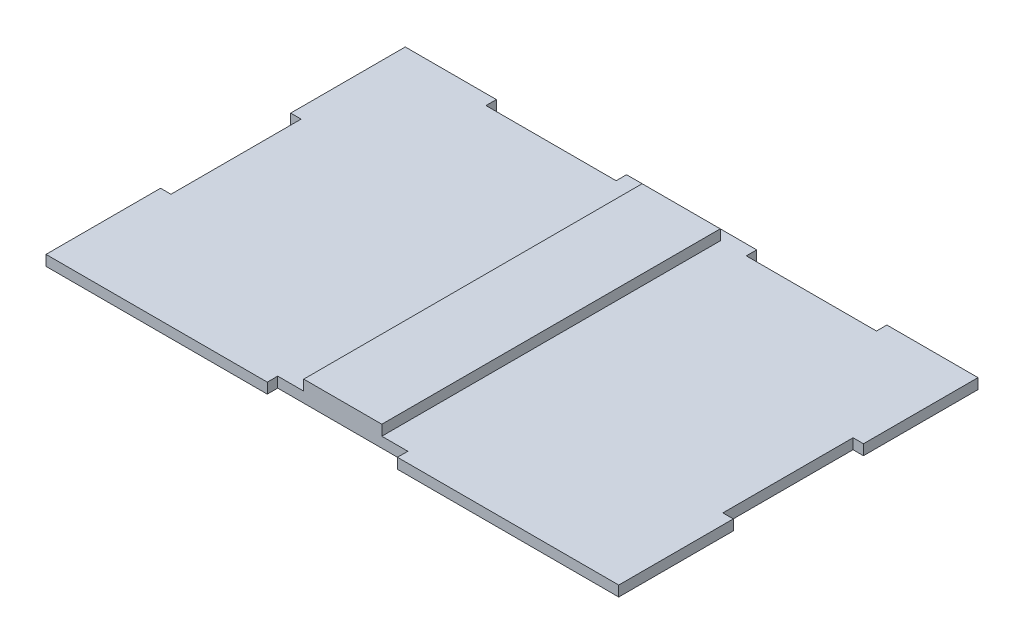
ISO-10303-21;
HEADER;
FILE_DESCRIPTION(('STEP AP214'),'2;1');
FILE_NAME('part.step','',(''),(''),'','','');
FILE_SCHEMA(('AUTOMOTIVE_DESIGN { 1 0 10303 214 1 1 1 1 }'));
ENDSEC;
DATA;
#1=APPLICATION_CONTEXT('core data for automotive mechanical design processes');
#2=APPLICATION_PROTOCOL_DEFINITION('international standard','automotive_design',2000,#1);
#3=PRODUCT_CONTEXT('',#1,'mechanical');
#4=PRODUCT('Part','Part','',(#3));
#5=PRODUCT_RELATED_PRODUCT_CATEGORY('part','',(#4));
#6=PRODUCT_DEFINITION_FORMATION('','',#4);
#7=PRODUCT_DEFINITION_CONTEXT('part definition',#1,'design');
#8=PRODUCT_DEFINITION('design','',#6,#7);
#9=PRODUCT_DEFINITION_SHAPE('','',#8);
#10=(LENGTH_UNIT() NAMED_UNIT(*) SI_UNIT(.MILLI.,.METRE.));
#11=(NAMED_UNIT(*) PLANE_ANGLE_UNIT() SI_UNIT($,.RADIAN.));
#12=(NAMED_UNIT(*) SI_UNIT($,.STERADIAN.) SOLID_ANGLE_UNIT());
#13=UNCERTAINTY_MEASURE_WITH_UNIT(LENGTH_MEASURE(1.E-05),#10,'distance_accuracy_value','');
#14=(GEOMETRIC_REPRESENTATION_CONTEXT(3) GLOBAL_UNCERTAINTY_ASSIGNED_CONTEXT((#13)) GLOBAL_UNIT_ASSIGNED_CONTEXT((#10,
#11,#12)) REPRESENTATION_CONTEXT('',''));
#15=CARTESIAN_POINT('',(0.,0.,0.));
#16=DIRECTION('',(0.,0.,1.));
#17=DIRECTION('',(1.,0.,0.));
#18=AXIS2_PLACEMENT_3D('',#15,#16,#17);
#19=CARTESIAN_POINT('',(-75.,4.,-69.));
#20=DIRECTION('',(0.,0.,1.));
#21=DIRECTION('',(1.,0.,0.));
#22=AXIS2_PLACEMENT_3D('',#19,#20,#21);
#23=PLANE('',#22);
#24=DIRECTION('',(-1.,0.,0.));
#25=VECTOR('',#24,1.);
#26=CARTESIAN_POINT('',(-75.,0.,-69.));
#27=LINE('',#26,#25);
#28=CARTESIAN_POINT('',(-75.,0.,-69.));
#29=VERTEX_POINT('',#28);
#30=CARTESIAN_POINT('',(-110.,0.,-69.));
#31=VERTEX_POINT('',#30);
#32=EDGE_CURVE('E255',#29,#31,#27,.T.);
#33=ORIENTED_EDGE('',*,*,#32,.T.);
#34=DIRECTION('',(0.,-1.,0.));
#35=VECTOR('',#34,1.);
#36=CARTESIAN_POINT('',(-110.,4.,-69.));
#37=LINE('',#36,#35);
#38=CARTESIAN_POINT('',(-110.,4.,-69.));
#39=VERTEX_POINT('',#38);
#40=EDGE_CURVE('E11',#39,#31,#37,.T.);
#41=ORIENTED_EDGE('',*,*,#40,.F.);
#42=DIRECTION('',(-1.,0.,0.));
#43=VECTOR('',#42,1.);
#44=CARTESIAN_POINT('',(-75.,4.,-69.));
#45=LINE('',#44,#43);
#46=CARTESIAN_POINT('',(-75.,4.,-69.));
#47=VERTEX_POINT('',#46);
#48=EDGE_CURVE('E266',#47,#39,#45,.T.);
#49=ORIENTED_EDGE('',*,*,#48,.F.);
#50=DIRECTION('',(0.,-1.,0.));
#51=VECTOR('',#50,1.);
#52=CARTESIAN_POINT('',(-75.,4.,-69.));
#53=LINE('',#52,#51);
#54=EDGE_CURVE('E339',#47,#29,#53,.T.);
#55=ORIENTED_EDGE('',*,*,#54,.T.);
#56=EDGE_LOOP('',(#33,#41,#49,#55));
#57=FACE_BOUND('',#56,.T.);
#58=ADVANCED_FACE('F45',(#57),#23,.F.);
#59=CARTESIAN_POINT('',(-110.,4.,-69.));
#60=DIRECTION('',(1.,0.,0.));
#61=DIRECTION('',(0.,0.,-1.));
#62=AXIS2_PLACEMENT_3D('',#59,#60,#61);
#63=PLANE('',#62);
#64=DIRECTION('',(0.,0.,1.));
#65=VECTOR('',#64,1.);
#66=CARTESIAN_POINT('',(-110.,0.,-69.));
#67=LINE('',#66,#65);
#68=CARTESIAN_POINT('',(-110.,0.,-25.));
#69=VERTEX_POINT('',#68);
#70=EDGE_CURVE('E260',#31,#69,#67,.T.);
#71=ORIENTED_EDGE('',*,*,#70,.T.);
#72=DIRECTION('',(0.,-1.,0.));
#73=VECTOR('',#72,1.);
#74=CARTESIAN_POINT('',(-110.,4.,-25.));
#75=LINE('',#74,#73);
#76=CARTESIAN_POINT('',(-110.,4.,-25.));
#77=VERTEX_POINT('',#76);
#78=EDGE_CURVE('E53',#77,#69,#75,.T.);
#79=ORIENTED_EDGE('',*,*,#78,.F.);
#80=DIRECTION('',(0.,0.,1.));
#81=VECTOR('',#80,1.);
#82=CARTESIAN_POINT('',(-110.,4.,-69.));
#83=LINE('',#82,#81);
#84=EDGE_CURVE('E270',#39,#77,#83,.T.);
#85=ORIENTED_EDGE('',*,*,#84,.F.);
#86=ORIENTED_EDGE('',*,*,#40,.T.);
#87=EDGE_LOOP('',(#71,#79,#85,#86));
#88=FACE_BOUND('',#87,.T.);
#89=ADVANCED_FACE('F522',(#88),#63,.F.);
#90=CARTESIAN_POINT('',(-106.,4.,-25.));
#91=DIRECTION('',(0.,0.,-1.));
#92=DIRECTION('',(-1.,0.,0.));
#93=AXIS2_PLACEMENT_3D('',#90,#91,#92);
#94=PLANE('',#93);
#95=DIRECTION('',(1.,0.,0.));
#96=VECTOR('',#95,1.);
#97=CARTESIAN_POINT('',(-106.,0.,-25.));
#98=LINE('',#97,#96);
#99=CARTESIAN_POINT('',(-106.,0.,-25.));
#100=VERTEX_POINT('',#99);
#101=EDGE_CURVE('E343',#69,#100,#98,.T.);
#102=ORIENTED_EDGE('',*,*,#101,.T.);
#103=DIRECTION('',(0.,-1.,0.));
#104=VECTOR('',#103,1.);
#105=CARTESIAN_POINT('',(-106.,4.,-25.));
#106=LINE('',#105,#104);
#107=CARTESIAN_POINT('',(-106.,4.,-25.));
#108=VERTEX_POINT('',#107);
#109=EDGE_CURVE('E491',#108,#100,#106,.T.);
#110=ORIENTED_EDGE('',*,*,#109,.F.);
#111=DIRECTION('',(1.,0.,0.));
#112=VECTOR('',#111,1.);
#113=CARTESIAN_POINT('',(-106.,4.,-25.));
#114=LINE('',#113,#112);
#115=EDGE_CURVE('E274',#77,#108,#114,.T.);
#116=ORIENTED_EDGE('',*,*,#115,.F.);
#117=ORIENTED_EDGE('',*,*,#78,.T.);
#118=EDGE_LOOP('',(#102,#110,#116,#117));
#119=FACE_BOUND('',#118,.T.);
#120=ADVANCED_FACE('F500',(#119),#94,.F.);
#121=CARTESIAN_POINT('',(-106.,4.,-25.));
#122=DIRECTION('',(1.,0.,0.));
#123=DIRECTION('',(0.,0.,-1.));
#124=AXIS2_PLACEMENT_3D('',#121,#122,#123);
#125=PLANE('',#124);
#126=DIRECTION('',(0.,0.,1.));
#127=VECTOR('',#126,1.);
#128=CARTESIAN_POINT('',(-106.,0.,-25.));
#129=LINE('',#128,#127);
#130=CARTESIAN_POINT('',(-106.,0.,25.));
#131=VERTEX_POINT('',#130);
#132=EDGE_CURVE('E346',#100,#131,#129,.T.);
#133=ORIENTED_EDGE('',*,*,#132,.T.);
#134=DIRECTION('',(0.,-1.,0.));
#135=VECTOR('',#134,1.);
#136=CARTESIAN_POINT('',(-106.,4.,25.));
#137=LINE('',#136,#135);
#138=CARTESIAN_POINT('',(-106.,4.,25.));
#139=VERTEX_POINT('',#138);
#140=EDGE_CURVE('E487',#139,#131,#137,.T.);
#141=ORIENTED_EDGE('',*,*,#140,.F.);
#142=DIRECTION('',(0.,0.,1.));
#143=VECTOR('',#142,1.);
#144=CARTESIAN_POINT('',(-106.,4.,-25.));
#145=LINE('',#144,#143);
#146=EDGE_CURVE('E277',#108,#139,#145,.T.);
#147=ORIENTED_EDGE('',*,*,#146,.F.);
#148=ORIENTED_EDGE('',*,*,#109,.T.);
#149=EDGE_LOOP('',(#133,#141,#147,#148));
#150=FACE_BOUND('',#149,.T.);
#151=ADVANCED_FACE('F511',(#150),#125,.F.);
#152=CARTESIAN_POINT('',(-106.,4.,25.));
#153=DIRECTION('',(0.,0.,1.));
#154=DIRECTION('',(1.,0.,0.));
#155=AXIS2_PLACEMENT_3D('',#152,#153,#154);
#156=PLANE('',#155);
#157=DIRECTION('',(-1.,0.,0.));
#158=VECTOR('',#157,1.);
#159=CARTESIAN_POINT('',(-106.,0.,25.));
#160=LINE('',#159,#158);
#161=CARTESIAN_POINT('',(-110.,0.,25.));
#162=VERTEX_POINT('',#161);
#163=EDGE_CURVE('E349',#131,#162,#160,.T.);
#164=ORIENTED_EDGE('',*,*,#163,.T.);
#165=DIRECTION('',(0.,-1.,0.));
#166=VECTOR('',#165,1.);
#167=CARTESIAN_POINT('',(-110.,4.,25.));
#168=LINE('',#167,#166);
#169=CARTESIAN_POINT('',(-110.,4.,25.));
#170=VERTEX_POINT('',#169);
#171=EDGE_CURVE('E483',#170,#162,#168,.T.);
#172=ORIENTED_EDGE('',*,*,#171,.F.);
#173=DIRECTION('',(-1.,0.,0.));
#174=VECTOR('',#173,1.);
#175=CARTESIAN_POINT('',(-106.,4.,25.));
#176=LINE('',#175,#174);
#177=EDGE_CURVE('E280',#139,#170,#176,.T.);
#178=ORIENTED_EDGE('',*,*,#177,.F.);
#179=ORIENTED_EDGE('',*,*,#140,.T.);
#180=EDGE_LOOP('',(#164,#172,#178,#179));
#181=FACE_BOUND('',#180,.T.);
#182=ADVANCED_FACE('F515',(#181),#156,.F.);
#183=CARTESIAN_POINT('',(-110.,4.,25.));
#184=DIRECTION('',(1.,0.,0.));
#185=DIRECTION('',(0.,0.,-1.));
#186=AXIS2_PLACEMENT_3D('',#183,#184,#185);
#187=PLANE('',#186);
#188=DIRECTION('',(0.,0.,1.));
#189=VECTOR('',#188,1.);
#190=CARTESIAN_POINT('',(-110.,0.,25.));
#191=LINE('',#190,#189);
#192=CARTESIAN_POINT('',(-110.,0.,69.));
#193=VERTEX_POINT('',#192);
#194=EDGE_CURVE('E352',#162,#193,#191,.T.);
#195=ORIENTED_EDGE('',*,*,#194,.T.);
#196=DIRECTION('',(0.,-1.,0.));
#197=VECTOR('',#196,1.);
#198=CARTESIAN_POINT('',(-110.,4.,69.));
#199=LINE('',#198,#197);
#200=CARTESIAN_POINT('',(-110.,4.,69.));
#201=VERTEX_POINT('',#200);
#202=EDGE_CURVE('E479',#201,#193,#199,.T.);
#203=ORIENTED_EDGE('',*,*,#202,.F.);
#204=DIRECTION('',(0.,0.,1.));
#205=VECTOR('',#204,1.);
#206=CARTESIAN_POINT('',(-110.,4.,25.));
#207=LINE('',#206,#205);
#208=EDGE_CURVE('E283',#170,#201,#207,.T.);
#209=ORIENTED_EDGE('',*,*,#208,.F.);
#210=ORIENTED_EDGE('',*,*,#171,.T.);
#211=EDGE_LOOP('',(#195,#203,#209,#210));
#212=FACE_BOUND('',#211,.T.);
#213=ADVANCED_FACE('F612',(#212),#187,.F.);
#214=CARTESIAN_POINT('',(-110.,4.,69.));
#215=DIRECTION('',(0.,0.,-1.));
#216=DIRECTION('',(-1.,0.,0.));
#217=AXIS2_PLACEMENT_3D('',#214,#215,#216);
#218=PLANE('',#217);
#219=DIRECTION('',(1.,0.,0.));
#220=VECTOR('',#219,1.);
#221=CARTESIAN_POINT('',(-110.,0.,69.));
#222=LINE('',#221,#220);
#223=CARTESIAN_POINT('',(-25.,0.,69.));
#224=VERTEX_POINT('',#223);
#225=EDGE_CURVE('E355',#193,#224,#222,.T.);
#226=ORIENTED_EDGE('',*,*,#225,.T.);
#227=DIRECTION('',(0.,-1.,0.));
#228=VECTOR('',#227,1.);
#229=CARTESIAN_POINT('',(-25.,4.,69.));
#230=LINE('',#229,#228);
#231=CARTESIAN_POINT('',(-25.,4.,69.));
#232=VERTEX_POINT('',#231);
#233=EDGE_CURVE('E475',#232,#224,#230,.T.);
#234=ORIENTED_EDGE('',*,*,#233,.F.);
#235=DIRECTION('',(1.,0.,0.));
#236=VECTOR('',#235,1.);
#237=CARTESIAN_POINT('',(-110.,4.,69.));
#238=LINE('',#237,#236);
#239=EDGE_CURVE('E286',#201,#232,#238,.T.);
#240=ORIENTED_EDGE('',*,*,#239,.F.);
#241=ORIENTED_EDGE('',*,*,#202,.T.);
#242=EDGE_LOOP('',(#226,#234,#240,#241));
#243=FACE_BOUND('',#242,.T.);
#244=ADVANCED_FACE('F610',(#243),#218,.F.);
#245=CARTESIAN_POINT('',(-25.,4.,65.));
#246=DIRECTION('',(-1.,0.,0.));
#247=DIRECTION('',(0.,0.,1.));
#248=AXIS2_PLACEMENT_3D('',#245,#246,#247);
#249=PLANE('',#248);
#250=DIRECTION('',(0.,0.,-1.));
#251=VECTOR('',#250,1.);
#252=CARTESIAN_POINT('',(-25.,0.,65.));
#253=LINE('',#252,#251);
#254=CARTESIAN_POINT('',(-25.,0.,65.));
#255=VERTEX_POINT('',#254);
#256=EDGE_CURVE('E358',#224,#255,#253,.T.);
#257=ORIENTED_EDGE('',*,*,#256,.T.);
#258=DIRECTION('',(0.,-1.,0.));
#259=VECTOR('',#258,1.);
#260=CARTESIAN_POINT('',(-25.,4.,65.));
#261=LINE('',#260,#259);
#262=CARTESIAN_POINT('',(-25.,4.,65.));
#263=VERTEX_POINT('',#262);
#264=EDGE_CURVE('E471',#263,#255,#261,.T.);
#265=ORIENTED_EDGE('',*,*,#264,.F.);
#266=DIRECTION('',(0.,0.,-1.));
#267=VECTOR('',#266,1.);
#268=CARTESIAN_POINT('',(-25.,4.,65.));
#269=LINE('',#268,#267);
#270=EDGE_CURVE('E289',#232,#263,#269,.T.);
#271=ORIENTED_EDGE('',*,*,#270,.F.);
#272=ORIENTED_EDGE('',*,*,#233,.T.);
#273=EDGE_LOOP('',(#257,#265,#271,#272));
#274=FACE_BOUND('',#273,.T.);
#275=ADVANCED_FACE('F606',(#274),#249,.F.);
#276=CARTESIAN_POINT('',(-25.,4.,65.));
#277=DIRECTION('',(0.,0.,-1.));
#278=DIRECTION('',(-1.,0.,0.));
#279=AXIS2_PLACEMENT_3D('',#276,#277,#278);
#280=PLANE('',#279);
#281=DIRECTION('',(1.,0.,0.));
#282=VECTOR('',#281,1.);
#283=CARTESIAN_POINT('',(-25.,0.,65.));
#284=LINE('',#283,#282);
#285=CARTESIAN_POINT('',(25.,0.,65.));
#286=VERTEX_POINT('',#285);
#287=EDGE_CURVE('E361',#255,#286,#284,.T.);
#288=ORIENTED_EDGE('',*,*,#287,.T.);
#289=DIRECTION('',(0.,-1.,0.));
#290=VECTOR('',#289,1.);
#291=CARTESIAN_POINT('',(25.,4.,65.));
#292=LINE('',#291,#290);
#293=CARTESIAN_POINT('',(25.,4.,65.));
#294=VERTEX_POINT('',#293);
#295=EDGE_CURVE('E467',#294,#286,#292,.T.);
#296=ORIENTED_EDGE('',*,*,#295,.F.);
#297=DIRECTION('',(1.,0.,0.));
#298=VECTOR('',#297,1.);
#299=CARTESIAN_POINT('',(-25.,4.,65.));
#300=LINE('',#299,#298);
#301=CARTESIAN_POINT('',(15.,4.,65.));
#302=VERTEX_POINT('',#301);
#303=EDGE_CURVE('E253',#302,#294,#300,.T.);
#304=ORIENTED_EDGE('',*,*,#303,.F.);
#305=DIRECTION('',(0.,-1.,0.));
#306=VECTOR('',#305,1.);
#307=CARTESIAN_POINT('',(15.,8.,65.));
#308=LINE('',#307,#306);
#309=CARTESIAN_POINT('',(15.,8.,65.));
#310=VERTEX_POINT('',#309);
#311=EDGE_CURVE('E233',#310,#302,#308,.T.);
#312=ORIENTED_EDGE('',*,*,#311,.F.);
#313=DIRECTION('',(1.,0.,0.));
#314=VECTOR('',#313,1.);
#315=CARTESIAN_POINT('',(15.,8.,65.));
#316=LINE('',#315,#314);
#317=CARTESIAN_POINT('',(-15.,8.,65.));
#318=VERTEX_POINT('',#317);
#319=EDGE_CURVE('E240',#318,#310,#316,.T.);
#320=ORIENTED_EDGE('',*,*,#319,.F.);
#321=DIRECTION('',(0.,-1.,0.));
#322=VECTOR('',#321,1.);
#323=CARTESIAN_POINT('',(-15.,8.,65.));
#324=LINE('',#323,#322);
#325=CARTESIAN_POINT('',(-15.,4.,65.));
#326=VERTEX_POINT('',#325);
#327=EDGE_CURVE('E846',#318,#326,#324,.T.);
#328=ORIENTED_EDGE('',*,*,#327,.T.);
#329=EDGE_CURVE('E292',#263,#326,#300,.T.);
#330=ORIENTED_EDGE('',*,*,#329,.F.);
#331=ORIENTED_EDGE('',*,*,#264,.T.);
#332=EDGE_LOOP('',(#288,#296,#304,#312,#320,#328,#330,#331));
#333=FACE_BOUND('',#332,.T.);
#334=ADVANCED_FACE('F251',(#333),#280,.F.);
#335=CARTESIAN_POINT('',(25.,4.,65.));
#336=DIRECTION('',(1.,0.,0.));
#337=DIRECTION('',(0.,0.,-1.));
#338=AXIS2_PLACEMENT_3D('',#335,#336,#337);
#339=PLANE('',#338);
#340=DIRECTION('',(0.,0.,1.));
#341=VECTOR('',#340,1.);
#342=CARTESIAN_POINT('',(25.,0.,65.));
#343=LINE('',#342,#341);
#344=CARTESIAN_POINT('',(25.,0.,69.));
#345=VERTEX_POINT('',#344);
#346=EDGE_CURVE('E364',#286,#345,#343,.T.);
#347=ORIENTED_EDGE('',*,*,#346,.T.);
#348=DIRECTION('',(0.,-1.,0.));
#349=VECTOR('',#348,1.);
#350=CARTESIAN_POINT('',(25.,4.,69.));
#351=LINE('',#350,#349);
#352=CARTESIAN_POINT('',(25.,4.,69.));
#353=VERTEX_POINT('',#352);
#354=EDGE_CURVE('E463',#353,#345,#351,.T.);
#355=ORIENTED_EDGE('',*,*,#354,.F.);
#356=DIRECTION('',(0.,0.,1.));
#357=VECTOR('',#356,1.);
#358=CARTESIAN_POINT('',(25.,4.,65.));
#359=LINE('',#358,#357);
#360=EDGE_CURVE('E295',#294,#353,#359,.T.);
#361=ORIENTED_EDGE('',*,*,#360,.F.);
#362=ORIENTED_EDGE('',*,*,#295,.T.);
#363=EDGE_LOOP('',(#347,#355,#361,#362));
#364=FACE_BOUND('',#363,.T.);
#365=ADVANCED_FACE('F598',(#364),#339,.F.);
#366=CARTESIAN_POINT('',(25.,4.,69.));
#367=DIRECTION('',(0.,0.,-1.));
#368=DIRECTION('',(-1.,0.,0.));
#369=AXIS2_PLACEMENT_3D('',#366,#367,#368);
#370=PLANE('',#369);
#371=DIRECTION('',(1.,0.,0.));
#372=VECTOR('',#371,1.);
#373=CARTESIAN_POINT('',(25.,0.,69.));
#374=LINE('',#373,#372);
#375=CARTESIAN_POINT('',(110.,0.,69.));
#376=VERTEX_POINT('',#375);
#377=EDGE_CURVE('E367',#345,#376,#374,.T.);
#378=ORIENTED_EDGE('',*,*,#377,.T.);
#379=DIRECTION('',(0.,-1.,0.));
#380=VECTOR('',#379,1.);
#381=CARTESIAN_POINT('',(110.,4.,69.));
#382=LINE('',#381,#380);
#383=CARTESIAN_POINT('',(110.,4.,69.));
#384=VERTEX_POINT('',#383);
#385=EDGE_CURVE('E459',#384,#376,#382,.T.);
#386=ORIENTED_EDGE('',*,*,#385,.F.);
#387=DIRECTION('',(1.,0.,0.));
#388=VECTOR('',#387,1.);
#389=CARTESIAN_POINT('',(25.,4.,69.));
#390=LINE('',#389,#388);
#391=EDGE_CURVE('E298',#353,#384,#390,.T.);
#392=ORIENTED_EDGE('',*,*,#391,.F.);
#393=ORIENTED_EDGE('',*,*,#354,.T.);
#394=EDGE_LOOP('',(#378,#386,#392,#393));
#395=FACE_BOUND('',#394,.T.);
#396=ADVANCED_FACE('F594',(#395),#370,.F.);
#397=CARTESIAN_POINT('',(110.,4.,69.));
#398=DIRECTION('',(-1.,0.,0.));
#399=DIRECTION('',(0.,0.,1.));
#400=AXIS2_PLACEMENT_3D('',#397,#398,#399);
#401=PLANE('',#400);
#402=DIRECTION('',(0.,0.,-1.));
#403=VECTOR('',#402,1.);
#404=CARTESIAN_POINT('',(110.,0.,69.));
#405=LINE('',#404,#403);
#406=CARTESIAN_POINT('',(110.,0.,25.));
#407=VERTEX_POINT('',#406);
#408=EDGE_CURVE('E370',#376,#407,#405,.T.);
#409=ORIENTED_EDGE('',*,*,#408,.T.);
#410=DIRECTION('',(0.,-1.,0.));
#411=VECTOR('',#410,1.);
#412=CARTESIAN_POINT('',(110.,4.,25.));
#413=LINE('',#412,#411);
#414=CARTESIAN_POINT('',(110.,4.,25.));
#415=VERTEX_POINT('',#414);
#416=EDGE_CURVE('E455',#415,#407,#413,.T.);
#417=ORIENTED_EDGE('',*,*,#416,.F.);
#418=DIRECTION('',(0.,0.,-1.));
#419=VECTOR('',#418,1.);
#420=CARTESIAN_POINT('',(110.,4.,69.));
#421=LINE('',#420,#419);
#422=EDGE_CURVE('E301',#384,#415,#421,.T.);
#423=ORIENTED_EDGE('',*,*,#422,.F.);
#424=ORIENTED_EDGE('',*,*,#385,.T.);
#425=EDGE_LOOP('',(#409,#417,#423,#424));
#426=FACE_BOUND('',#425,.T.);
#427=ADVANCED_FACE('F589',(#426),#401,.F.);
#428=CARTESIAN_POINT('',(106.,4.,25.));
#429=DIRECTION('',(0.,0.,1.));
#430=DIRECTION('',(1.,0.,0.));
#431=AXIS2_PLACEMENT_3D('',#428,#429,#430);
#432=PLANE('',#431);
#433=DIRECTION('',(-1.,0.,0.));
#434=VECTOR('',#433,1.);
#435=CARTESIAN_POINT('',(106.,0.,25.));
#436=LINE('',#435,#434);
#437=CARTESIAN_POINT('',(106.,0.,25.));
#438=VERTEX_POINT('',#437);
#439=EDGE_CURVE('E373',#407,#438,#436,.T.);
#440=ORIENTED_EDGE('',*,*,#439,.T.);
#441=DIRECTION('',(0.,-1.,0.));
#442=VECTOR('',#441,1.);
#443=CARTESIAN_POINT('',(106.,4.,25.));
#444=LINE('',#443,#442);
#445=CARTESIAN_POINT('',(106.,4.,25.));
#446=VERTEX_POINT('',#445);
#447=EDGE_CURVE('E451',#446,#438,#444,.T.);
#448=ORIENTED_EDGE('',*,*,#447,.F.);
#449=DIRECTION('',(-1.,0.,0.));
#450=VECTOR('',#449,1.);
#451=CARTESIAN_POINT('',(106.,4.,25.));
#452=LINE('',#451,#450);
#453=EDGE_CURVE('E304',#415,#446,#452,.T.);
#454=ORIENTED_EDGE('',*,*,#453,.F.);
#455=ORIENTED_EDGE('',*,*,#416,.T.);
#456=EDGE_LOOP('',(#440,#448,#454,#455));
#457=FACE_BOUND('',#456,.T.);
#458=ADVANCED_FACE('F583',(#457),#432,.F.);
#459=CARTESIAN_POINT('',(106.,4.,-25.));
#460=DIRECTION('',(-1.,0.,0.));
#461=DIRECTION('',(0.,0.,1.));
#462=AXIS2_PLACEMENT_3D('',#459,#460,#461);
#463=PLANE('',#462);
#464=DIRECTION('',(0.,0.,-1.));
#465=VECTOR('',#464,1.);
#466=CARTESIAN_POINT('',(106.,0.,-25.));
#467=LINE('',#466,#465);
#468=CARTESIAN_POINT('',(106.,0.,-25.));
#469=VERTEX_POINT('',#468);
#470=EDGE_CURVE('E376',#438,#469,#467,.T.);
#471=ORIENTED_EDGE('',*,*,#470,.T.);
#472=DIRECTION('',(0.,-1.,0.));
#473=VECTOR('',#472,1.);
#474=CARTESIAN_POINT('',(106.,4.,-25.));
#475=LINE('',#474,#473);
#476=CARTESIAN_POINT('',(106.,4.,-25.));
#477=VERTEX_POINT('',#476);
#478=EDGE_CURVE('E447',#477,#469,#475,.T.);
#479=ORIENTED_EDGE('',*,*,#478,.F.);
#480=DIRECTION('',(0.,0.,-1.));
#481=VECTOR('',#480,1.);
#482=CARTESIAN_POINT('',(106.,4.,-25.));
#483=LINE('',#482,#481);
#484=EDGE_CURVE('E307',#446,#477,#483,.T.);
#485=ORIENTED_EDGE('',*,*,#484,.F.);
#486=ORIENTED_EDGE('',*,*,#447,.T.);
#487=EDGE_LOOP('',(#471,#479,#485,#486));
#488=FACE_BOUND('',#487,.T.);
#489=ADVANCED_FACE('F579',(#488),#463,.F.);
#490=CARTESIAN_POINT('',(106.,4.,-25.));
#491=DIRECTION('',(0.,0.,-1.));
#492=DIRECTION('',(-1.,0.,0.));
#493=AXIS2_PLACEMENT_3D('',#490,#491,#492);
#494=PLANE('',#493);
#495=DIRECTION('',(1.,0.,0.));
#496=VECTOR('',#495,1.);
#497=CARTESIAN_POINT('',(106.,0.,-25.));
#498=LINE('',#497,#496);
#499=CARTESIAN_POINT('',(110.,0.,-25.));
#500=VERTEX_POINT('',#499);
#501=EDGE_CURVE('E379',#469,#500,#498,.T.);
#502=ORIENTED_EDGE('',*,*,#501,.T.);
#503=DIRECTION('',(0.,-1.,0.));
#504=VECTOR('',#503,1.);
#505=CARTESIAN_POINT('',(110.,4.,-25.));
#506=LINE('',#505,#504);
#507=CARTESIAN_POINT('',(110.,4.,-25.));
#508=VERTEX_POINT('',#507);
#509=EDGE_CURVE('E443',#508,#500,#506,.T.);
#510=ORIENTED_EDGE('',*,*,#509,.F.);
#511=DIRECTION('',(1.,0.,0.));
#512=VECTOR('',#511,1.);
#513=CARTESIAN_POINT('',(106.,4.,-25.));
#514=LINE('',#513,#512);
#515=EDGE_CURVE('E310',#477,#508,#514,.T.);
#516=ORIENTED_EDGE('',*,*,#515,.F.);
#517=ORIENTED_EDGE('',*,*,#478,.T.);
#518=EDGE_LOOP('',(#502,#510,#516,#517));
#519=FACE_BOUND('',#518,.T.);
#520=ADVANCED_FACE('F574',(#519),#494,.F.);
#521=CARTESIAN_POINT('',(110.,4.,-25.));
#522=DIRECTION('',(-1.,0.,0.));
#523=DIRECTION('',(0.,0.,1.));
#524=AXIS2_PLACEMENT_3D('',#521,#522,#523);
#525=PLANE('',#524);
#526=DIRECTION('',(0.,0.,-1.));
#527=VECTOR('',#526,1.);
#528=CARTESIAN_POINT('',(110.,0.,-25.));
#529=LINE('',#528,#527);
#530=CARTESIAN_POINT('',(110.,0.,-69.));
#531=VERTEX_POINT('',#530);
#532=EDGE_CURVE('E382',#500,#531,#529,.T.);
#533=ORIENTED_EDGE('',*,*,#532,.T.);
#534=DIRECTION('',(0.,-1.,0.));
#535=VECTOR('',#534,1.);
#536=CARTESIAN_POINT('',(110.,4.,-69.));
#537=LINE('',#536,#535);
#538=CARTESIAN_POINT('',(110.,4.,-69.));
#539=VERTEX_POINT('',#538);
#540=EDGE_CURVE('E439',#539,#531,#537,.T.);
#541=ORIENTED_EDGE('',*,*,#540,.F.);
#542=DIRECTION('',(0.,0.,-1.));
#543=VECTOR('',#542,1.);
#544=CARTESIAN_POINT('',(110.,4.,-25.));
#545=LINE('',#544,#543);
#546=EDGE_CURVE('E313',#508,#539,#545,.T.);
#547=ORIENTED_EDGE('',*,*,#546,.F.);
#548=ORIENTED_EDGE('',*,*,#509,.T.);
#549=EDGE_LOOP('',(#533,#541,#547,#548));
#550=FACE_BOUND('',#549,.T.);
#551=ADVANCED_FACE('F568',(#550),#525,.F.);
#552=CARTESIAN_POINT('',(110.,4.,-69.));
#553=DIRECTION('',(0.,0.,1.));
#554=DIRECTION('',(1.,0.,0.));
#555=AXIS2_PLACEMENT_3D('',#552,#553,#554);
#556=PLANE('',#555);
#557=DIRECTION('',(-1.,0.,0.));
#558=VECTOR('',#557,1.);
#559=CARTESIAN_POINT('',(110.,0.,-69.));
#560=LINE('',#559,#558);
#561=CARTESIAN_POINT('',(75.,0.,-69.));
#562=VERTEX_POINT('',#561);
#563=EDGE_CURVE('E385',#531,#562,#560,.T.);
#564=ORIENTED_EDGE('',*,*,#563,.T.);
#565=DIRECTION('',(0.,-1.,0.));
#566=VECTOR('',#565,1.);
#567=CARTESIAN_POINT('',(75.,4.,-69.));
#568=LINE('',#567,#566);
#569=CARTESIAN_POINT('',(75.,4.,-69.));
#570=VERTEX_POINT('',#569);
#571=EDGE_CURVE('E435',#570,#562,#568,.T.);
#572=ORIENTED_EDGE('',*,*,#571,.F.);
#573=DIRECTION('',(-1.,0.,0.));
#574=VECTOR('',#573,1.);
#575=CARTESIAN_POINT('',(110.,4.,-69.));
#576=LINE('',#575,#574);
#577=EDGE_CURVE('E316',#539,#570,#576,.T.);
#578=ORIENTED_EDGE('',*,*,#577,.F.);
#579=ORIENTED_EDGE('',*,*,#540,.T.);
#580=EDGE_LOOP('',(#564,#572,#578,#579));
#581=FACE_BOUND('',#580,.T.);
#582=ADVANCED_FACE('F564',(#581),#556,.F.);
#583=CARTESIAN_POINT('',(75.,4.,-65.));
#584=DIRECTION('',(1.,0.,0.));
#585=DIRECTION('',(0.,0.,-1.));
#586=AXIS2_PLACEMENT_3D('',#583,#584,#585);
#587=PLANE('',#586);
#588=DIRECTION('',(0.,0.,1.));
#589=VECTOR('',#588,1.);
#590=CARTESIAN_POINT('',(75.,0.,-65.));
#591=LINE('',#590,#589);
#592=CARTESIAN_POINT('',(75.,0.,-65.));
#593=VERTEX_POINT('',#592);
#594=EDGE_CURVE('E388',#562,#593,#591,.T.);
#595=ORIENTED_EDGE('',*,*,#594,.T.);
#596=DIRECTION('',(0.,-1.,0.));
#597=VECTOR('',#596,1.);
#598=CARTESIAN_POINT('',(75.,4.,-65.));
#599=LINE('',#598,#597);
#600=CARTESIAN_POINT('',(75.,4.,-65.));
#601=VERTEX_POINT('',#600);
#602=EDGE_CURVE('E431',#601,#593,#599,.T.);
#603=ORIENTED_EDGE('',*,*,#602,.F.);
#604=DIRECTION('',(0.,0.,1.));
#605=VECTOR('',#604,1.);
#606=CARTESIAN_POINT('',(75.,4.,-65.));
#607=LINE('',#606,#605);
#608=EDGE_CURVE('E319',#570,#601,#607,.T.);
#609=ORIENTED_EDGE('',*,*,#608,.F.);
#610=ORIENTED_EDGE('',*,*,#571,.T.);
#611=EDGE_LOOP('',(#595,#603,#609,#610));
#612=FACE_BOUND('',#611,.T.);
#613=ADVANCED_FACE('F559',(#612),#587,.F.);
#614=CARTESIAN_POINT('',(25.,4.,-65.));
#615=DIRECTION('',(0.,0.,1.));
#616=DIRECTION('',(1.,0.,0.));
#617=AXIS2_PLACEMENT_3D('',#614,#615,#616);
#618=PLANE('',#617);
#619=DIRECTION('',(-1.,0.,0.));
#620=VECTOR('',#619,1.);
#621=CARTESIAN_POINT('',(25.,0.,-65.));
#622=LINE('',#621,#620);
#623=CARTESIAN_POINT('',(25.,0.,-65.));
#624=VERTEX_POINT('',#623);
#625=EDGE_CURVE('E391',#593,#624,#622,.T.);
#626=ORIENTED_EDGE('',*,*,#625,.T.);
#627=DIRECTION('',(0.,-1.,0.));
#628=VECTOR('',#627,1.);
#629=CARTESIAN_POINT('',(25.,4.,-65.));
#630=LINE('',#629,#628);
#631=CARTESIAN_POINT('',(25.,4.,-65.));
#632=VERTEX_POINT('',#631);
#633=EDGE_CURVE('E427',#632,#624,#630,.T.);
#634=ORIENTED_EDGE('',*,*,#633,.F.);
#635=DIRECTION('',(-1.,0.,0.));
#636=VECTOR('',#635,1.);
#637=CARTESIAN_POINT('',(25.,4.,-65.));
#638=LINE('',#637,#636);
#639=EDGE_CURVE('E322',#601,#632,#638,.T.);
#640=ORIENTED_EDGE('',*,*,#639,.F.);
#641=ORIENTED_EDGE('',*,*,#602,.T.);
#642=EDGE_LOOP('',(#626,#634,#640,#641));
#643=FACE_BOUND('',#642,.T.);
#644=ADVANCED_FACE('F553',(#643),#618,.F.);
#645=CARTESIAN_POINT('',(25.,4.,-65.));
#646=DIRECTION('',(-1.,0.,0.));
#647=DIRECTION('',(0.,0.,1.));
#648=AXIS2_PLACEMENT_3D('',#645,#646,#647);
#649=PLANE('',#648);
#650=DIRECTION('',(0.,0.,-1.));
#651=VECTOR('',#650,1.);
#652=CARTESIAN_POINT('',(25.,0.,-65.));
#653=LINE('',#652,#651);
#654=CARTESIAN_POINT('',(25.,0.,-69.));
#655=VERTEX_POINT('',#654);
#656=EDGE_CURVE('E394',#624,#655,#653,.T.);
#657=ORIENTED_EDGE('',*,*,#656,.T.);
#658=DIRECTION('',(0.,-1.,0.));
#659=VECTOR('',#658,1.);
#660=CARTESIAN_POINT('',(25.,4.,-69.));
#661=LINE('',#660,#659);
#662=CARTESIAN_POINT('',(25.,4.,-69.));
#663=VERTEX_POINT('',#662);
#664=EDGE_CURVE('E423',#663,#655,#661,.T.);
#665=ORIENTED_EDGE('',*,*,#664,.F.);
#666=DIRECTION('',(0.,0.,-1.));
#667=VECTOR('',#666,1.);
#668=CARTESIAN_POINT('',(25.,4.,-65.));
#669=LINE('',#668,#667);
#670=EDGE_CURVE('E325',#632,#663,#669,.T.);
#671=ORIENTED_EDGE('',*,*,#670,.F.);
#672=ORIENTED_EDGE('',*,*,#633,.T.);
#673=EDGE_LOOP('',(#657,#665,#671,#672));
#674=FACE_BOUND('',#673,.T.);
#675=ADVANCED_FACE('F549',(#674),#649,.F.);
#676=CARTESIAN_POINT('',(25.,4.,-69.));
#677=DIRECTION('',(0.,0.,1.));
#678=DIRECTION('',(1.,0.,0.));
#679=AXIS2_PLACEMENT_3D('',#676,#677,#678);
#680=PLANE('',#679);
#681=DIRECTION('',(-1.,0.,0.));
#682=VECTOR('',#681,1.);
#683=CARTESIAN_POINT('',(25.,0.,-69.));
#684=LINE('',#683,#682);
#685=CARTESIAN_POINT('',(-25.,0.,-69.));
#686=VERTEX_POINT('',#685);
#687=EDGE_CURVE('E397',#655,#686,#684,.T.);
#688=ORIENTED_EDGE('',*,*,#687,.T.);
#689=DIRECTION('',(0.,-1.,0.));
#690=VECTOR('',#689,1.);
#691=CARTESIAN_POINT('',(-25.,4.,-69.));
#692=LINE('',#691,#690);
#693=CARTESIAN_POINT('',(-25.,4.,-69.));
#694=VERTEX_POINT('',#693);
#695=EDGE_CURVE('E419',#694,#686,#692,.T.);
#696=ORIENTED_EDGE('',*,*,#695,.F.);
#697=DIRECTION('',(-1.,0.,0.));
#698=VECTOR('',#697,1.);
#699=CARTESIAN_POINT('',(25.,4.,-69.));
#700=LINE('',#699,#698);
#701=EDGE_CURVE('E328',#663,#694,#700,.T.);
#702=ORIENTED_EDGE('',*,*,#701,.F.);
#703=ORIENTED_EDGE('',*,*,#664,.T.);
#704=EDGE_LOOP('',(#688,#696,#702,#703));
#705=FACE_BOUND('',#704,.T.);
#706=ADVANCED_FACE('F544',(#705),#680,.F.);
#707=CARTESIAN_POINT('',(-25.,4.,-65.));
#708=DIRECTION('',(1.,0.,0.));
#709=DIRECTION('',(0.,0.,-1.));
#710=AXIS2_PLACEMENT_3D('',#707,#708,#709);
#711=PLANE('',#710);
#712=DIRECTION('',(0.,0.,1.));
#713=VECTOR('',#712,1.);
#714=CARTESIAN_POINT('',(-25.,0.,-65.));
#715=LINE('',#714,#713);
#716=CARTESIAN_POINT('',(-25.,0.,-65.));
#717=VERTEX_POINT('',#716);
#718=EDGE_CURVE('E400',#686,#717,#715,.T.);
#719=ORIENTED_EDGE('',*,*,#718,.T.);
#720=DIRECTION('',(0.,-1.,0.));
#721=VECTOR('',#720,1.);
#722=CARTESIAN_POINT('',(-25.,4.,-65.));
#723=LINE('',#722,#721);
#724=CARTESIAN_POINT('',(-25.,4.,-65.));
#725=VERTEX_POINT('',#724);
#726=EDGE_CURVE('E415',#725,#717,#723,.T.);
#727=ORIENTED_EDGE('',*,*,#726,.F.);
#728=DIRECTION('',(0.,0.,1.));
#729=VECTOR('',#728,1.);
#730=CARTESIAN_POINT('',(-25.,4.,-65.));
#731=LINE('',#730,#729);
#732=EDGE_CURVE('E331',#694,#725,#731,.T.);
#733=ORIENTED_EDGE('',*,*,#732,.F.);
#734=ORIENTED_EDGE('',*,*,#695,.T.);
#735=EDGE_LOOP('',(#719,#727,#733,#734));
#736=FACE_BOUND('',#735,.T.);
#737=ADVANCED_FACE('F538',(#736),#711,.F.);
#738=CARTESIAN_POINT('',(-75.,4.,-65.));
#739=DIRECTION('',(0.,0.,1.));
#740=DIRECTION('',(1.,0.,0.));
#741=AXIS2_PLACEMENT_3D('',#738,#739,#740);
#742=PLANE('',#741);
#743=DIRECTION('',(-1.,0.,0.));
#744=VECTOR('',#743,1.);
#745=CARTESIAN_POINT('',(-75.,0.,-65.));
#746=LINE('',#745,#744);
#747=CARTESIAN_POINT('',(-75.,0.,-65.));
#748=VERTEX_POINT('',#747);
#749=EDGE_CURVE('E403',#717,#748,#746,.T.);
#750=ORIENTED_EDGE('',*,*,#749,.T.);
#751=DIRECTION('',(0.,-1.,0.));
#752=VECTOR('',#751,1.);
#753=CARTESIAN_POINT('',(-75.,4.,-65.));
#754=LINE('',#753,#752);
#755=CARTESIAN_POINT('',(-75.,4.,-65.));
#756=VERTEX_POINT('',#755);
#757=EDGE_CURVE('E411',#756,#748,#754,.T.);
#758=ORIENTED_EDGE('',*,*,#757,.F.);
#759=DIRECTION('',(-1.,0.,0.));
#760=VECTOR('',#759,1.);
#761=CARTESIAN_POINT('',(-75.,4.,-65.));
#762=LINE('',#761,#760);
#763=EDGE_CURVE('E334',#725,#756,#762,.T.);
#764=ORIENTED_EDGE('',*,*,#763,.F.);
#765=ORIENTED_EDGE('',*,*,#726,.T.);
#766=EDGE_LOOP('',(#750,#758,#764,#765));
#767=FACE_BOUND('',#766,.T.);
#768=ADVANCED_FACE('F534',(#767),#742,.F.);
#769=CARTESIAN_POINT('',(-75.,4.,-65.));
#770=DIRECTION('',(-1.,0.,0.));
#771=DIRECTION('',(0.,0.,1.));
#772=AXIS2_PLACEMENT_3D('',#769,#770,#771);
#773=PLANE('',#772);
#774=DIRECTION('',(0.,0.,-1.));
#775=VECTOR('',#774,1.);
#776=CARTESIAN_POINT('',(-75.,0.,-65.));
#777=LINE('',#776,#775);
#778=EDGE_CURVE('E271',#748,#29,#777,.T.);
#779=ORIENTED_EDGE('',*,*,#778,.T.);
#780=ORIENTED_EDGE('',*,*,#54,.F.);
#781=DIRECTION('',(0.,0.,-1.));
#782=VECTOR('',#781,1.);
#783=CARTESIAN_POINT('',(-75.,4.,-65.));
#784=LINE('',#783,#782);
#785=EDGE_CURVE('E337',#756,#47,#784,.T.);
#786=ORIENTED_EDGE('',*,*,#785,.F.);
#787=ORIENTED_EDGE('',*,*,#757,.T.);
#788=EDGE_LOOP('',(#779,#780,#786,#787));
#789=FACE_BOUND('',#788,.T.);
#790=ADVANCED_FACE('F529',(#789),#773,.F.);
#791=CARTESIAN_POINT('',(0.,4.,0.));
#792=DIRECTION('',(0.,1.,0.));
#793=DIRECTION('',(0.,0.,1.));
#794=AXIS2_PLACEMENT_3D('',#791,#792,#793);
#795=PLANE('',#794);
#796=DIRECTION('',(0.,0.,1.));
#797=VECTOR('',#796,1.);
#798=CARTESIAN_POINT('',(-15.,4.,65.));
#799=LINE('',#798,#797);
#800=CARTESIAN_POINT('',(-15.,4.,-65.));
#801=VERTEX_POINT('',#800);
#802=EDGE_CURVE('E60',#801,#326,#799,.T.);
#803=ORIENTED_EDGE('',*,*,#802,.F.);
#804=DIRECTION('',(-1.,0.,0.));
#805=VECTOR('',#804,1.);
#806=CARTESIAN_POINT('',(-15.,4.,-65.));
#807=LINE('',#806,#805);
#808=CARTESIAN_POINT('',(15.,4.,-65.));
#809=VERTEX_POINT('',#808);
#810=EDGE_CURVE('E849',#809,#801,#807,.T.);
#811=ORIENTED_EDGE('',*,*,#810,.F.);
#812=DIRECTION('',(0.,0.,-1.));
#813=VECTOR('',#812,1.);
#814=CARTESIAN_POINT('',(15.,4.,-65.));
#815=LINE('',#814,#813);
#816=EDGE_CURVE('E66',#302,#809,#815,.T.);
#817=ORIENTED_EDGE('',*,*,#816,.F.);
#818=ORIENTED_EDGE('',*,*,#303,.T.);
#819=ORIENTED_EDGE('',*,*,#360,.T.);
#820=ORIENTED_EDGE('',*,*,#391,.T.);
#821=ORIENTED_EDGE('',*,*,#422,.T.);
#822=ORIENTED_EDGE('',*,*,#453,.T.);
#823=ORIENTED_EDGE('',*,*,#484,.T.);
#824=ORIENTED_EDGE('',*,*,#515,.T.);
#825=ORIENTED_EDGE('',*,*,#546,.T.);
#826=ORIENTED_EDGE('',*,*,#577,.T.);
#827=ORIENTED_EDGE('',*,*,#608,.T.);
#828=ORIENTED_EDGE('',*,*,#639,.T.);
#829=ORIENTED_EDGE('',*,*,#670,.T.);
#830=ORIENTED_EDGE('',*,*,#701,.T.);
#831=ORIENTED_EDGE('',*,*,#732,.T.);
#832=ORIENTED_EDGE('',*,*,#763,.T.);
#833=ORIENTED_EDGE('',*,*,#785,.T.);
#834=ORIENTED_EDGE('',*,*,#48,.T.);
#835=ORIENTED_EDGE('',*,*,#84,.T.);
#836=ORIENTED_EDGE('',*,*,#115,.T.);
#837=ORIENTED_EDGE('',*,*,#146,.T.);
#838=ORIENTED_EDGE('',*,*,#177,.T.);
#839=ORIENTED_EDGE('',*,*,#208,.T.);
#840=ORIENTED_EDGE('',*,*,#239,.T.);
#841=ORIENTED_EDGE('',*,*,#270,.T.);
#842=ORIENTED_EDGE('',*,*,#329,.T.);
#843=EDGE_LOOP('',(#803,#811,#817,#818,#819,#820,#821,#822,#823,#824,#825,#826,#827,#828,#829,
#830,#831,#832,#833,#834,#835,#836,#837,#838,#839,#840,#841,#842));
#844=FACE_BOUND('',#843,.T.);
#845=ADVANCED_FACE('F518',(#844),#795,.T.);
#846=CARTESIAN_POINT('',(0.,0.,0.));
#847=DIRECTION('',(0.,1.,0.));
#848=DIRECTION('',(0.,0.,1.));
#849=AXIS2_PLACEMENT_3D('',#846,#847,#848);
#850=PLANE('',#849);
#851=ORIENTED_EDGE('',*,*,#32,.F.);
#852=ORIENTED_EDGE('',*,*,#778,.F.);
#853=ORIENTED_EDGE('',*,*,#749,.F.);
#854=ORIENTED_EDGE('',*,*,#718,.F.);
#855=ORIENTED_EDGE('',*,*,#687,.F.);
#856=ORIENTED_EDGE('',*,*,#656,.F.);
#857=ORIENTED_EDGE('',*,*,#625,.F.);
#858=ORIENTED_EDGE('',*,*,#594,.F.);
#859=ORIENTED_EDGE('',*,*,#563,.F.);
#860=ORIENTED_EDGE('',*,*,#532,.F.);
#861=ORIENTED_EDGE('',*,*,#501,.F.);
#862=ORIENTED_EDGE('',*,*,#470,.F.);
#863=ORIENTED_EDGE('',*,*,#439,.F.);
#864=ORIENTED_EDGE('',*,*,#408,.F.);
#865=ORIENTED_EDGE('',*,*,#377,.F.);
#866=ORIENTED_EDGE('',*,*,#346,.F.);
#867=ORIENTED_EDGE('',*,*,#287,.F.);
#868=ORIENTED_EDGE('',*,*,#256,.F.);
#869=ORIENTED_EDGE('',*,*,#225,.F.);
#870=ORIENTED_EDGE('',*,*,#194,.F.);
#871=ORIENTED_EDGE('',*,*,#163,.F.);
#872=ORIENTED_EDGE('',*,*,#132,.F.);
#873=ORIENTED_EDGE('',*,*,#101,.F.);
#874=ORIENTED_EDGE('',*,*,#70,.F.);
#875=EDGE_LOOP('',(#851,#852,#853,#854,#855,#856,#857,#858,#859,#860,#861,#862,#863,#864,#865,
#866,#867,#868,#869,#870,#871,#872,#873,#874));
#876=FACE_BOUND('',#875,.T.);
#877=ADVANCED_FACE('F506',(#876),#850,.F.);
#878=CARTESIAN_POINT('',(15.,8.,-65.));
#879=DIRECTION('',(-1.,0.,0.));
#880=DIRECTION('',(0.,0.,1.));
#881=AXIS2_PLACEMENT_3D('',#878,#879,#880);
#882=PLANE('',#881);
#883=ORIENTED_EDGE('',*,*,#816,.T.);
#884=DIRECTION('',(0.,-1.,0.));
#885=VECTOR('',#884,1.);
#886=CARTESIAN_POINT('',(15.,8.,-65.));
#887=LINE('',#886,#885);
#888=CARTESIAN_POINT('',(15.,8.,-65.));
#889=VERTEX_POINT('',#888);
#890=EDGE_CURVE('E235',#889,#809,#887,.T.);
#891=ORIENTED_EDGE('',*,*,#890,.F.);
#892=DIRECTION('',(0.,0.,-1.));
#893=VECTOR('',#892,1.);
#894=CARTESIAN_POINT('',(15.,8.,-65.));
#895=LINE('',#894,#893);
#896=EDGE_CURVE('E229',#310,#889,#895,.T.);
#897=ORIENTED_EDGE('',*,*,#896,.F.);
#898=ORIENTED_EDGE('',*,*,#311,.T.);
#899=EDGE_LOOP('',(#883,#891,#897,#898));
#900=FACE_BOUND('',#899,.T.);
#901=ADVANCED_FACE('F231',(#900),#882,.F.);
#902=CARTESIAN_POINT('',(-15.,8.,-65.));
#903=DIRECTION('',(0.,0.,1.));
#904=DIRECTION('',(1.,0.,0.));
#905=AXIS2_PLACEMENT_3D('',#902,#903,#904);
#906=PLANE('',#905);
#907=ORIENTED_EDGE('',*,*,#810,.T.);
#908=DIRECTION('',(0.,-1.,0.));
#909=VECTOR('',#908,1.);
#910=CARTESIAN_POINT('',(-15.,8.,-65.));
#911=LINE('',#910,#909);
#912=CARTESIAN_POINT('',(-15.,8.,-65.));
#913=VERTEX_POINT('',#912);
#914=EDGE_CURVE('E262',#913,#801,#911,.T.);
#915=ORIENTED_EDGE('',*,*,#914,.F.);
#916=DIRECTION('',(-1.,0.,0.));
#917=VECTOR('',#916,1.);
#918=CARTESIAN_POINT('',(-15.,8.,-65.));
#919=LINE('',#918,#917);
#920=EDGE_CURVE('E239',#889,#913,#919,.T.);
#921=ORIENTED_EDGE('',*,*,#920,.F.);
#922=ORIENTED_EDGE('',*,*,#890,.T.);
#923=EDGE_LOOP('',(#907,#915,#921,#922));
#924=FACE_BOUND('',#923,.T.);
#925=ADVANCED_FACE('F814',(#924),#906,.F.);
#926=CARTESIAN_POINT('',(-15.,8.,65.));
#927=DIRECTION('',(1.,0.,0.));
#928=DIRECTION('',(0.,0.,-1.));
#929=AXIS2_PLACEMENT_3D('',#926,#927,#928);
#930=PLANE('',#929);
#931=ORIENTED_EDGE('',*,*,#802,.T.);
#932=ORIENTED_EDGE('',*,*,#327,.F.);
#933=DIRECTION('',(0.,0.,1.));
#934=VECTOR('',#933,1.);
#935=CARTESIAN_POINT('',(-15.,8.,65.));
#936=LINE('',#935,#934);
#937=EDGE_CURVE('E245',#913,#318,#936,.T.);
#938=ORIENTED_EDGE('',*,*,#937,.F.);
#939=ORIENTED_EDGE('',*,*,#914,.T.);
#940=EDGE_LOOP('',(#931,#932,#938,#939));
#941=FACE_BOUND('',#940,.T.);
#942=ADVANCED_FACE('F822',(#941),#930,.F.);
#943=CARTESIAN_POINT('',(0.,8.,0.));
#944=DIRECTION('',(0.,-1.,0.));
#945=DIRECTION('',(0.,0.,-1.));
#946=AXIS2_PLACEMENT_3D('',#943,#944,#945);
#947=PLANE('',#946);
#948=ORIENTED_EDGE('',*,*,#319,.T.);
#949=ORIENTED_EDGE('',*,*,#896,.T.);
#950=ORIENTED_EDGE('',*,*,#920,.T.);
#951=ORIENTED_EDGE('',*,*,#937,.T.);
#952=EDGE_LOOP('',(#948,#949,#950,#951));
#953=FACE_BOUND('',#952,.T.);
#954=ADVANCED_FACE('F243',(#953),#947,.F.);
#955=CLOSED_SHELL('',(#58,#89,#120,#151,#182,#213,#244,#275,#334,#365,#396,#427,#458,#489,#520,
#551,#582,#613,#644,#675,#706,#737,#768,#790,#845,#877,#901,#925,#942,#954));
#956=MANIFOLD_SOLID_BREP('B2',#955);
#957=ADVANCED_BREP_SHAPE_REPRESENTATION('',(#18,#956),#14);
#958=SHAPE_DEFINITION_REPRESENTATION(#9,#957);
ENDSEC;
END-ISO-10303-21;
